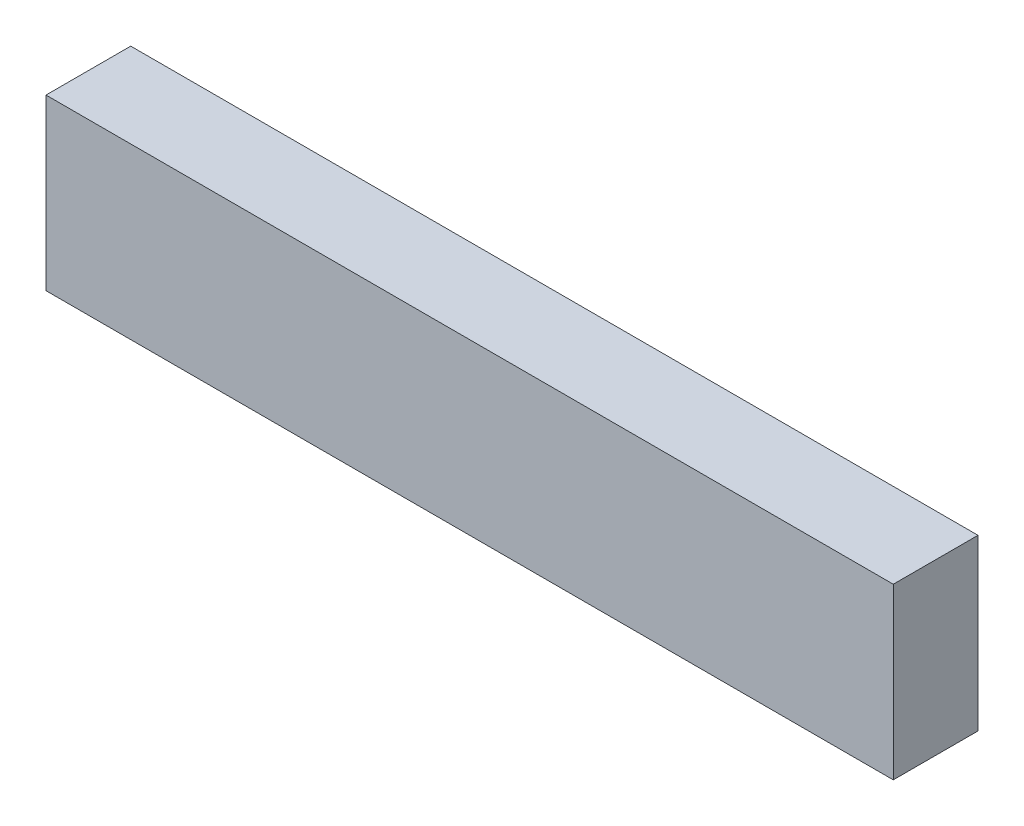
ISO-10303-21;
HEADER;
FILE_DESCRIPTION(('STEP AP214'),'2;1');
FILE_NAME('part.step','',(''),(''),'','','');
FILE_SCHEMA(('AUTOMOTIVE_DESIGN { 1 0 10303 214 1 1 1 1 }'));
ENDSEC;
DATA;
#1=APPLICATION_CONTEXT('core data for automotive mechanical design processes');
#2=APPLICATION_PROTOCOL_DEFINITION('international standard','automotive_design',2000,#1);
#3=PRODUCT_CONTEXT('',#1,'mechanical');
#4=PRODUCT('Part','Part','',(#3));
#5=PRODUCT_RELATED_PRODUCT_CATEGORY('part','',(#4));
#6=PRODUCT_DEFINITION_FORMATION('','',#4);
#7=PRODUCT_DEFINITION_CONTEXT('part definition',#1,'design');
#8=PRODUCT_DEFINITION('design','',#6,#7);
#9=PRODUCT_DEFINITION_SHAPE('','',#8);
#10=(LENGTH_UNIT() NAMED_UNIT(*) SI_UNIT(.MILLI.,.METRE.));
#11=(NAMED_UNIT(*) PLANE_ANGLE_UNIT() SI_UNIT($,.RADIAN.));
#12=(NAMED_UNIT(*) SI_UNIT($,.STERADIAN.) SOLID_ANGLE_UNIT());
#13=UNCERTAINTY_MEASURE_WITH_UNIT(LENGTH_MEASURE(1.E-05),#10,'distance_accuracy_value','');
#14=(GEOMETRIC_REPRESENTATION_CONTEXT(3) GLOBAL_UNCERTAINTY_ASSIGNED_CONTEXT((#13)) GLOBAL_UNIT_ASSIGNED_CONTEXT((#10,
#11,#12)) REPRESENTATION_CONTEXT('',''));
#15=CARTESIAN_POINT('',(0.,0.,0.));
#16=DIRECTION('',(0.,0.,1.));
#17=DIRECTION('',(1.,0.,0.));
#18=AXIS2_PLACEMENT_3D('',#15,#16,#17);
#19=CARTESIAN_POINT('',(10000.,32.8387931303611,0.));
#20=DIRECTION('',(0.,0.,1.));
#21=DIRECTION('',(0.,-1.,0.));
#22=AXIS2_PLACEMENT_3D('',#19,#20,#21);
#23=PLANE('',#22);
#24=DIRECTION('',(0.,1.,0.));
#25=VECTOR('',#24,1.);
#26=CARTESIAN_POINT('',(0.,32.8387931303611,0.));
#27=LINE('',#26,#25);
#28=CARTESIAN_POINT('',(0.,-1967.16120686964,-2.44929359829471E-13));
#29=VERTEX_POINT('',#28);
#30=CARTESIAN_POINT('',(0.,32.8387931303611,0.));
#31=VERTEX_POINT('',#30);
#32=EDGE_CURVE('E100',#29,#31,#27,.T.);
#33=ORIENTED_EDGE('',*,*,#32,.T.);
#34=DIRECTION('',(-1.,0.,0.));
#35=VECTOR('',#34,1.);
#36=CARTESIAN_POINT('',(10000.,32.8387931303611,0.));
#37=LINE('',#36,#35);
#38=CARTESIAN_POINT('',(10000.,32.8387931303611,0.));
#39=VERTEX_POINT('',#38);
#40=EDGE_CURVE('E11',#39,#31,#37,.T.);
#41=ORIENTED_EDGE('',*,*,#40,.F.);
#42=DIRECTION('',(0.,1.,0.));
#43=VECTOR('',#42,1.);
#44=CARTESIAN_POINT('',(10000.,32.8387931303611,0.));
#45=LINE('',#44,#43);
#46=CARTESIAN_POINT('',(10000.,-1967.16120686964,-2.44929359829471E-13));
#47=VERTEX_POINT('',#46);
#48=EDGE_CURVE('E88',#47,#39,#45,.T.);
#49=ORIENTED_EDGE('',*,*,#48,.F.);
#50=DIRECTION('',(-1.,0.,0.));
#51=VECTOR('',#50,1.);
#52=CARTESIAN_POINT('',(10000.,-1967.16120686964,-2.44929359829471E-13));
#53=LINE('',#52,#51);
#54=EDGE_CURVE('E96',#47,#29,#53,.T.);
#55=ORIENTED_EDGE('',*,*,#54,.T.);
#56=EDGE_LOOP('',(#33,#41,#49,#55));
#57=FACE_BOUND('',#56,.T.);
#58=ADVANCED_FACE('F37',(#57),#23,.F.);
#59=CARTESIAN_POINT('',(10000.,32.8387931303611,0.));
#60=DIRECTION('',(0.,-1.,0.));
#61=DIRECTION('',(0.,0.,-1.));
#62=AXIS2_PLACEMENT_3D('',#59,#60,#61);
#63=PLANE('',#62);
#64=DIRECTION('',(0.,0.,1.));
#65=VECTOR('',#64,1.);
#66=CARTESIAN_POINT('',(0.,32.8387931303611,0.));
#67=LINE('',#66,#65);
#68=CARTESIAN_POINT('',(0.,32.838793130361,1000.));
#69=VERTEX_POINT('',#68);
#70=EDGE_CURVE('E92',#31,#69,#67,.T.);
#71=ORIENTED_EDGE('',*,*,#70,.T.);
#72=DIRECTION('',(-1.,0.,0.));
#73=VECTOR('',#72,1.);
#74=CARTESIAN_POINT('',(10000.,32.838793130361,1000.));
#75=LINE('',#74,#73);
#76=CARTESIAN_POINT('',(10000.,32.838793130361,1000.));
#77=VERTEX_POINT('',#76);
#78=EDGE_CURVE('E45',#77,#69,#75,.T.);
#79=ORIENTED_EDGE('',*,*,#78,.F.);
#80=DIRECTION('',(0.,0.,1.));
#81=VECTOR('',#80,1.);
#82=CARTESIAN_POINT('',(10000.,32.8387931303611,0.));
#83=LINE('',#82,#81);
#84=EDGE_CURVE('E83',#39,#77,#83,.T.);
#85=ORIENTED_EDGE('',*,*,#84,.F.);
#86=ORIENTED_EDGE('',*,*,#40,.T.);
#87=EDGE_LOOP('',(#71,#79,#85,#86));
#88=FACE_BOUND('',#87,.T.);
#89=ADVANCED_FACE('F91',(#88),#63,.F.);
#90=CARTESIAN_POINT('',(10000.,32.838793130361,1000.));
#91=DIRECTION('',(0.,0.,-1.));
#92=DIRECTION('',(0.,1.,0.));
#93=AXIS2_PLACEMENT_3D('',#90,#91,#92);
#94=PLANE('',#93);
#95=DIRECTION('',(0.,-1.,0.));
#96=VECTOR('',#95,1.);
#97=CARTESIAN_POINT('',(0.,32.838793130361,1000.));
#98=LINE('',#97,#96);
#99=CARTESIAN_POINT('',(0.,-1967.16120686964,1000.));
#100=VERTEX_POINT('',#99);
#101=EDGE_CURVE('E70',#69,#100,#98,.T.);
#102=ORIENTED_EDGE('',*,*,#101,.T.);
#103=DIRECTION('',(-1.,0.,0.));
#104=VECTOR('',#103,1.);
#105=CARTESIAN_POINT('',(10000.,-1967.16120686964,1000.));
#106=LINE('',#105,#104);
#107=CARTESIAN_POINT('',(10000.,-1967.16120686964,1000.));
#108=VERTEX_POINT('',#107);
#109=EDGE_CURVE('E93',#108,#100,#106,.T.);
#110=ORIENTED_EDGE('',*,*,#109,.F.);
#111=DIRECTION('',(0.,-1.,0.));
#112=VECTOR('',#111,1.);
#113=CARTESIAN_POINT('',(10000.,32.838793130361,1000.));
#114=LINE('',#113,#112);
#115=EDGE_CURVE('E86',#77,#108,#114,.T.);
#116=ORIENTED_EDGE('',*,*,#115,.F.);
#117=ORIENTED_EDGE('',*,*,#78,.T.);
#118=EDGE_LOOP('',(#102,#110,#116,#117));
#119=FACE_BOUND('',#118,.T.);
#120=ADVANCED_FACE('F94',(#119),#94,.F.);
#121=CARTESIAN_POINT('',(10000.,-1967.16120686964,-2.44929359829471E-13));
#122=DIRECTION('',(0.,1.,0.));
#123=DIRECTION('',(0.,0.,1.));
#124=AXIS2_PLACEMENT_3D('',#121,#122,#123);
#125=PLANE('',#124);
#126=DIRECTION('',(0.,0.,-1.));
#127=VECTOR('',#126,1.);
#128=CARTESIAN_POINT('',(0.,-1967.16120686964,-2.44929359829471E-13));
#129=LINE('',#128,#127);
#130=EDGE_CURVE('E76',#100,#29,#129,.T.);
#131=ORIENTED_EDGE('',*,*,#130,.T.);
#132=ORIENTED_EDGE('',*,*,#54,.F.);
#133=DIRECTION('',(0.,0.,-1.));
#134=VECTOR('',#133,1.);
#135=CARTESIAN_POINT('',(10000.,-1967.16120686964,-2.44929359829471E-13));
#136=LINE('',#135,#134);
#137=EDGE_CURVE('E53',#108,#47,#136,.T.);
#138=ORIENTED_EDGE('',*,*,#137,.F.);
#139=ORIENTED_EDGE('',*,*,#109,.T.);
#140=EDGE_LOOP('',(#131,#132,#138,#139));
#141=FACE_BOUND('',#140,.T.);
#142=ADVANCED_FACE('F107',(#141),#125,.F.);
#143=CARTESIAN_POINT('',(10000.,-1967.16120686964,-2.44929359829471E-13));
#144=DIRECTION('',(-1.,0.,0.));
#145=DIRECTION('',(0.,0.,1.));
#146=AXIS2_PLACEMENT_3D('',#143,#144,#145);
#147=PLANE('',#146);
#148=ORIENTED_EDGE('',*,*,#48,.T.);
#149=ORIENTED_EDGE('',*,*,#84,.T.);
#150=ORIENTED_EDGE('',*,*,#115,.T.);
#151=ORIENTED_EDGE('',*,*,#137,.T.);
#152=EDGE_LOOP('',(#148,#149,#150,#151));
#153=FACE_BOUND('',#152,.T.);
#154=ADVANCED_FACE('F84',(#153),#147,.F.);
#155=CARTESIAN_POINT('',(0.,-1967.16120686964,-2.44929359829471E-13));
#156=DIRECTION('',(-1.,0.,0.));
#157=DIRECTION('',(0.,0.,1.));
#158=AXIS2_PLACEMENT_3D('',#155,#156,#157);
#159=PLANE('',#158);
#160=ORIENTED_EDGE('',*,*,#32,.F.);
#161=ORIENTED_EDGE('',*,*,#130,.F.);
#162=ORIENTED_EDGE('',*,*,#101,.F.);
#163=ORIENTED_EDGE('',*,*,#70,.F.);
#164=EDGE_LOOP('',(#160,#161,#162,#163));
#165=FACE_BOUND('',#164,.T.);
#166=ADVANCED_FACE('F110',(#165),#159,.T.);
#167=CLOSED_SHELL('',(#58,#89,#120,#142,#154,#166));
#168=MANIFOLD_SOLID_BREP('B2',#167);
#169=ADVANCED_BREP_SHAPE_REPRESENTATION('',(#18,#168),#14);
#170=SHAPE_DEFINITION_REPRESENTATION(#9,#169);
ENDSEC;
END-ISO-10303-21;
